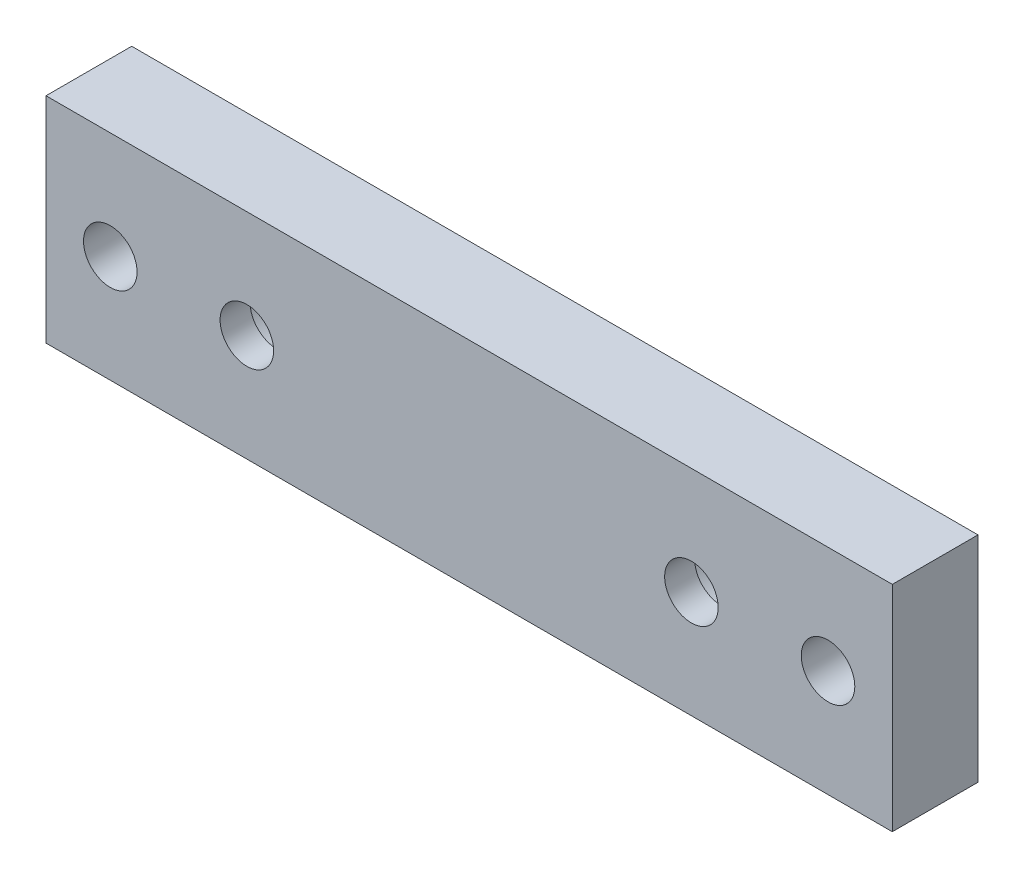
ISO-10303-21;
HEADER;
FILE_DESCRIPTION(('STEP AP214'),'2;1');
FILE_NAME('part.step','',(''),(''),'','','');
FILE_SCHEMA(('AUTOMOTIVE_DESIGN { 1 0 10303 214 1 1 1 1 }'));
ENDSEC;
DATA;
#1=APPLICATION_CONTEXT('core data for automotive mechanical design processes');
#2=APPLICATION_PROTOCOL_DEFINITION('international standard','automotive_design',2000,#1);
#3=PRODUCT_CONTEXT('',#1,'mechanical');
#4=PRODUCT('Part','Part','',(#3));
#5=PRODUCT_RELATED_PRODUCT_CATEGORY('part','',(#4));
#6=PRODUCT_DEFINITION_FORMATION('','',#4);
#7=PRODUCT_DEFINITION_CONTEXT('part definition',#1,'design');
#8=PRODUCT_DEFINITION('design','',#6,#7);
#9=PRODUCT_DEFINITION_SHAPE('','',#8);
#10=(LENGTH_UNIT() NAMED_UNIT(*) SI_UNIT(.MILLI.,.METRE.));
#11=(NAMED_UNIT(*) PLANE_ANGLE_UNIT() SI_UNIT($,.RADIAN.));
#12=(NAMED_UNIT(*) SI_UNIT($,.STERADIAN.) SOLID_ANGLE_UNIT());
#13=UNCERTAINTY_MEASURE_WITH_UNIT(LENGTH_MEASURE(1.E-05),#10,'distance_accuracy_value','');
#14=(GEOMETRIC_REPRESENTATION_CONTEXT(3) GLOBAL_UNCERTAINTY_ASSIGNED_CONTEXT((#13)) GLOBAL_UNIT_ASSIGNED_CONTEXT((#10,
#11,#12)) REPRESENTATION_CONTEXT('',''));
#15=CARTESIAN_POINT('',(0.,0.,0.));
#16=DIRECTION('',(0.,0.,1.));
#17=DIRECTION('',(1.,0.,0.));
#18=AXIS2_PLACEMENT_3D('',#15,#16,#17);
#19=CARTESIAN_POINT('',(19.5122728736646,0.,8.));
#20=DIRECTION('',(1.,0.,0.));
#21=DIRECTION('',(0.,1.,0.));
#22=AXIS2_PLACEMENT_3D('',#19,#20,#21);
#23=PLANE('',#22);
#24=DIRECTION('',(0.,-1.,0.));
#25=VECTOR('',#24,1.);
#26=CARTESIAN_POINT('',(19.5122728736646,0.,0.));
#27=LINE('',#26,#25);
#28=CARTESIAN_POINT('',(19.5122728736646,46.5405148843649,0.));
#29=VERTEX_POINT('',#28);
#30=CARTESIAN_POINT('',(19.5122728736646,26.5405148843649,0.));
#31=VERTEX_POINT('',#30);
#32=EDGE_CURVE('E120',#29,#31,#27,.T.);
#33=ORIENTED_EDGE('',*,*,#32,.F.);
#34=DIRECTION('',(0.,0.,-1.));
#35=VECTOR('',#34,1.);
#36=CARTESIAN_POINT('',(19.5122728736646,46.5405148843649,8.));
#37=LINE('',#36,#35);
#38=CARTESIAN_POINT('',(19.5122728736646,46.5405148843649,8.));
#39=VERTEX_POINT('',#38);
#40=EDGE_CURVE('E11',#39,#29,#37,.T.);
#41=ORIENTED_EDGE('',*,*,#40,.F.);
#42=DIRECTION('',(0.,-1.,0.));
#43=VECTOR('',#42,1.);
#44=CARTESIAN_POINT('',(19.5122728736646,0.,8.));
#45=LINE('',#44,#43);
#46=CARTESIAN_POINT('',(19.5122728736646,26.5405148843649,8.));
#47=VERTEX_POINT('',#46);
#48=EDGE_CURVE('E100',#39,#47,#45,.T.);
#49=ORIENTED_EDGE('',*,*,#48,.T.);
#50=DIRECTION('',(0.,0.,-1.));
#51=VECTOR('',#50,1.);
#52=CARTESIAN_POINT('',(19.5122728736646,26.5405148843649,8.));
#53=LINE('',#52,#51);
#54=EDGE_CURVE('E77',#47,#31,#53,.T.);
#55=ORIENTED_EDGE('',*,*,#54,.T.);
#56=EDGE_LOOP('',(#33,#41,#49,#55));
#57=FACE_BOUND('',#56,.T.);
#58=ADVANCED_FACE('F35',(#57),#23,.T.);
#59=CARTESIAN_POINT('',(0.,46.5405148843649,8.));
#60=DIRECTION('',(0.,1.,0.));
#61=DIRECTION('',(0.,0.,1.));
#62=AXIS2_PLACEMENT_3D('',#59,#60,#61);
#63=PLANE('',#62);
#64=DIRECTION('',(1.,0.,0.));
#65=VECTOR('',#64,1.);
#66=CARTESIAN_POINT('',(0.,46.5405148843649,0.));
#67=LINE('',#66,#65);
#68=CARTESIAN_POINT('',(-59.4877271263354,46.5405148843649,0.));
#69=VERTEX_POINT('',#68);
#70=EDGE_CURVE('E89',#69,#29,#67,.T.);
#71=ORIENTED_EDGE('',*,*,#70,.F.);
#72=DIRECTION('',(0.,0.,-1.));
#73=VECTOR('',#72,1.);
#74=CARTESIAN_POINT('',(-59.4877271263354,46.5405148843649,8.));
#75=LINE('',#74,#73);
#76=CARTESIAN_POINT('',(-59.4877271263354,46.5405148843649,8.));
#77=VERTEX_POINT('',#76);
#78=EDGE_CURVE('E45',#77,#69,#75,.T.);
#79=ORIENTED_EDGE('',*,*,#78,.F.);
#80=DIRECTION('',(1.,0.,0.));
#81=VECTOR('',#80,1.);
#82=CARTESIAN_POINT('',(0.,46.5405148843649,8.));
#83=LINE('',#82,#81);
#84=EDGE_CURVE('E87',#77,#39,#83,.T.);
#85=ORIENTED_EDGE('',*,*,#84,.T.);
#86=ORIENTED_EDGE('',*,*,#40,.T.);
#87=EDGE_LOOP('',(#71,#79,#85,#86));
#88=FACE_BOUND('',#87,.T.);
#89=ADVANCED_FACE('F85',(#88),#63,.T.);
#90=CARTESIAN_POINT('',(-59.4877271263354,0.,8.));
#91=DIRECTION('',(1.,0.,0.));
#92=DIRECTION('',(0.,0.,-1.));
#93=AXIS2_PLACEMENT_3D('',#90,#91,#92);
#94=PLANE('',#93);
#95=DIRECTION('',(0.,-1.,0.));
#96=VECTOR('',#95,1.);
#97=CARTESIAN_POINT('',(-59.4877271263354,0.,0.));
#98=LINE('',#97,#96);
#99=CARTESIAN_POINT('',(-59.4877271263354,26.5405148843649,0.));
#100=VERTEX_POINT('',#99);
#101=EDGE_CURVE('E123',#69,#100,#98,.T.);
#102=ORIENTED_EDGE('',*,*,#101,.T.);
#103=DIRECTION('',(0.,0.,-1.));
#104=VECTOR('',#103,1.);
#105=CARTESIAN_POINT('',(-59.4877271263354,26.5405148843649,8.));
#106=LINE('',#105,#104);
#107=CARTESIAN_POINT('',(-59.4877271263354,26.5405148843649,8.));
#108=VERTEX_POINT('',#107);
#109=EDGE_CURVE('E92',#108,#100,#106,.T.);
#110=ORIENTED_EDGE('',*,*,#109,.F.);
#111=DIRECTION('',(0.,-1.,0.));
#112=VECTOR('',#111,1.);
#113=CARTESIAN_POINT('',(-59.4877271263354,0.,8.));
#114=LINE('',#113,#112);
#115=EDGE_CURVE('E95',#77,#108,#114,.T.);
#116=ORIENTED_EDGE('',*,*,#115,.F.);
#117=ORIENTED_EDGE('',*,*,#78,.T.);
#118=EDGE_LOOP('',(#102,#110,#116,#117));
#119=FACE_BOUND('',#118,.T.);
#120=ADVANCED_FACE('F96',(#119),#94,.F.);
#121=CARTESIAN_POINT('',(-40.7377271263354,36.5405148843649,8.));
#122=DIRECTION('',(0.,0.,-1.));
#123=DIRECTION('',(-1.,0.,0.));
#124=AXIS2_PLACEMENT_3D('',#121,#122,#123);
#125=CYLINDRICAL_SURFACE('',#124,2.5);
#126=CARTESIAN_POINT('',(-40.7377271263354,36.5405148843649,5.2));
#127=DIRECTION('',(0.,0.,1.));
#128=DIRECTION('',(1.,0.,0.));
#129=AXIS2_PLACEMENT_3D('',#126,#127,#128);
#130=CIRCLE('',#129,2.5);
#131=CARTESIAN_POINT('',(-38.2377271263354,36.5405148843649,5.2));
#132=VERTEX_POINT('',#131);
#133=EDGE_CURVE('E39',#132,#132,#130,.T.);
#134=ORIENTED_EDGE('',*,*,#133,.F.);
#135=EDGE_LOOP('',(#134));
#136=FACE_BOUND('',#135,.T.);
#137=CARTESIAN_POINT('',(-40.7377271263354,36.5405148843649,8.));
#138=DIRECTION('',(0.,0.,1.));
#139=DIRECTION('',(1.,0.,0.));
#140=AXIS2_PLACEMENT_3D('',#137,#138,#139);
#141=CIRCLE('',#140,2.5);
#142=CARTESIAN_POINT('',(-38.2377271263354,36.5405148843649,8.));
#143=VERTEX_POINT('',#142);
#144=EDGE_CURVE('E107',#143,#143,#141,.T.);
#145=ORIENTED_EDGE('',*,*,#144,.T.);
#146=EDGE_LOOP('',(#145));
#147=FACE_BOUND('',#146,.T.);
#148=ADVANCED_FACE('F180',(#136,#147),#125,.F.);
#149=CARTESIAN_POINT('',(0.,26.5405148843649,8.));
#150=DIRECTION('',(0.,1.,0.));
#151=DIRECTION('',(0.,0.,1.));
#152=AXIS2_PLACEMENT_3D('',#149,#150,#151);
#153=PLANE('',#152);
#154=DIRECTION('',(1.,0.,0.));
#155=VECTOR('',#154,1.);
#156=CARTESIAN_POINT('',(0.,26.5405148843649,0.));
#157=LINE('',#156,#155);
#158=EDGE_CURVE('E70',#100,#31,#157,.T.);
#159=ORIENTED_EDGE('',*,*,#158,.T.);
#160=ORIENTED_EDGE('',*,*,#54,.F.);
#161=DIRECTION('',(1.,0.,0.));
#162=VECTOR('',#161,1.);
#163=CARTESIAN_POINT('',(0.,26.5405148843649,8.));
#164=LINE('',#163,#162);
#165=EDGE_CURVE('E54',#108,#47,#164,.T.);
#166=ORIENTED_EDGE('',*,*,#165,.F.);
#167=ORIENTED_EDGE('',*,*,#109,.T.);
#168=EDGE_LOOP('',(#159,#160,#166,#167));
#169=FACE_BOUND('',#168,.T.);
#170=ADVANCED_FACE('F174',(#169),#153,.F.);
#171=CARTESIAN_POINT('',(-53.4877271263354,36.5405148843649,8.));
#172=DIRECTION('',(0.,0.,-1.));
#173=DIRECTION('',(-1.,0.,0.));
#174=AXIS2_PLACEMENT_3D('',#171,#172,#173);
#175=CYLINDRICAL_SURFACE('',#174,2.5);
#176=CARTESIAN_POINT('',(-53.4877271263354,36.5405148843649,8.));
#177=DIRECTION('',(0.,0.,1.));
#178=DIRECTION('',(1.,0.,0.));
#179=AXIS2_PLACEMENT_3D('',#176,#177,#178);
#180=CIRCLE('',#179,2.5);
#181=CARTESIAN_POINT('',(-50.9877271263354,36.5405148843649,8.));
#182=VERTEX_POINT('',#181);
#183=EDGE_CURVE('E102',#182,#182,#180,.T.);
#184=ORIENTED_EDGE('',*,*,#183,.T.);
#185=EDGE_LOOP('',(#184));
#186=FACE_BOUND('',#185,.T.);
#187=CARTESIAN_POINT('',(-53.4877271263354,36.5405148843649,0.));
#188=DIRECTION('',(0.,0.,1.));
#189=DIRECTION('',(1.,0.,0.));
#190=AXIS2_PLACEMENT_3D('',#187,#188,#189);
#191=CIRCLE('',#190,2.5);
#192=CARTESIAN_POINT('',(-50.9877271263354,36.5405148843649,0.));
#193=VERTEX_POINT('',#192);
#194=EDGE_CURVE('E116',#193,#193,#191,.T.);
#195=ORIENTED_EDGE('',*,*,#194,.F.);
#196=EDGE_LOOP('',(#195));
#197=FACE_BOUND('',#196,.T.);
#198=ADVANCED_FACE('F147',(#186,#197),#175,.F.);
#199=CARTESIAN_POINT('',(13.5122728736646,36.5405148843649,8.));
#200=DIRECTION('',(0.,0.,-1.));
#201=DIRECTION('',(-1.,0.,0.));
#202=AXIS2_PLACEMENT_3D('',#199,#200,#201);
#203=CYLINDRICAL_SURFACE('',#202,2.5);
#204=CARTESIAN_POINT('',(13.5122728736646,36.5405148843649,8.));
#205=DIRECTION('',(0.,0.,1.));
#206=DIRECTION('',(1.,0.,0.));
#207=AXIS2_PLACEMENT_3D('',#204,#205,#206);
#208=CIRCLE('',#207,2.5);
#209=CARTESIAN_POINT('',(16.0122728736646,36.5405148843649,8.));
#210=VERTEX_POINT('',#209);
#211=EDGE_CURVE('E126',#210,#210,#208,.T.);
#212=ORIENTED_EDGE('',*,*,#211,.T.);
#213=EDGE_LOOP('',(#212));
#214=FACE_BOUND('',#213,.T.);
#215=CARTESIAN_POINT('',(13.5122728736646,36.5405148843649,0.));
#216=DIRECTION('',(0.,0.,1.));
#217=DIRECTION('',(1.,0.,0.));
#218=AXIS2_PLACEMENT_3D('',#215,#216,#217);
#219=CIRCLE('',#218,2.5);
#220=CARTESIAN_POINT('',(16.0122728736646,36.5405148843649,0.));
#221=VERTEX_POINT('',#220);
#222=EDGE_CURVE('E113',#221,#221,#219,.T.);
#223=ORIENTED_EDGE('',*,*,#222,.F.);
#224=EDGE_LOOP('',(#223));
#225=FACE_BOUND('',#224,.T.);
#226=ADVANCED_FACE('F37',(#214,#225),#203,.F.);
#227=CARTESIAN_POINT('',(0.762272873664621,36.5405148843649,8.));
#228=DIRECTION('',(0.,0.,-1.));
#229=DIRECTION('',(-1.,0.,0.));
#230=AXIS2_PLACEMENT_3D('',#227,#228,#229);
#231=CYLINDRICAL_SURFACE('',#230,2.5);
#232=CARTESIAN_POINT('',(0.762272873664621,36.5405148843649,5.2));
#233=DIRECTION('',(0.,0.,1.));
#234=DIRECTION('',(1.,0.,0.));
#235=AXIS2_PLACEMENT_3D('',#232,#233,#234);
#236=CIRCLE('',#235,2.5);
#237=CARTESIAN_POINT('',(3.26227287366462,36.5405148843649,5.2));
#238=VERTEX_POINT('',#237);
#239=EDGE_CURVE('E117',#238,#238,#236,.T.);
#240=ORIENTED_EDGE('',*,*,#239,.F.);
#241=EDGE_LOOP('',(#240));
#242=FACE_BOUND('',#241,.T.);
#243=CARTESIAN_POINT('',(0.762272873664621,36.5405148843649,8.));
#244=DIRECTION('',(0.,0.,1.));
#245=DIRECTION('',(1.,0.,0.));
#246=AXIS2_PLACEMENT_3D('',#243,#244,#245);
#247=CIRCLE('',#246,2.5);
#248=CARTESIAN_POINT('',(3.26227287366462,36.5405148843649,8.));
#249=VERTEX_POINT('',#248);
#250=EDGE_CURVE('E110',#249,#249,#247,.T.);
#251=ORIENTED_EDGE('',*,*,#250,.T.);
#252=EDGE_LOOP('',(#251));
#253=FACE_BOUND('',#252,.T.);
#254=ADVANCED_FACE('F152',(#242,#253),#231,.F.);
#255=CARTESIAN_POINT('',(0.,0.,8.));
#256=DIRECTION('',(0.,0.,1.));
#257=DIRECTION('',(1.,0.,0.));
#258=AXIS2_PLACEMENT_3D('',#255,#256,#257);
#259=PLANE('',#258);
#260=ORIENTED_EDGE('',*,*,#211,.F.);
#261=EDGE_LOOP('',(#260));
#262=FACE_BOUND('',#261,.T.);
#263=ORIENTED_EDGE('',*,*,#183,.F.);
#264=EDGE_LOOP('',(#263));
#265=FACE_BOUND('',#264,.T.);
#266=ORIENTED_EDGE('',*,*,#48,.F.);
#267=ORIENTED_EDGE('',*,*,#84,.F.);
#268=ORIENTED_EDGE('',*,*,#115,.T.);
#269=ORIENTED_EDGE('',*,*,#165,.T.);
#270=EDGE_LOOP('',(#266,#267,#268,#269));
#271=FACE_BOUND('',#270,.T.);
#272=ORIENTED_EDGE('',*,*,#144,.F.);
#273=EDGE_LOOP('',(#272));
#274=FACE_BOUND('',#273,.T.);
#275=ORIENTED_EDGE('',*,*,#250,.F.);
#276=EDGE_LOOP('',(#275));
#277=FACE_BOUND('',#276,.T.);
#278=ADVANCED_FACE('F98',(#262,#265,#271,#274,#277),#259,.T.);
#279=CARTESIAN_POINT('',(0.,0.,0.));
#280=DIRECTION('',(0.,0.,1.));
#281=DIRECTION('',(1.,0.,0.));
#282=AXIS2_PLACEMENT_3D('',#279,#280,#281);
#283=PLANE('',#282);
#284=CARTESIAN_POINT('',(-40.7377271263354,36.5405148843649,0.));
#285=DIRECTION('',(0.,0.,1.));
#286=DIRECTION('',(1.,0.,0.));
#287=AXIS2_PLACEMENT_3D('',#284,#285,#286);
#288=CIRCLE('',#287,4.5);
#289=CARTESIAN_POINT('',(-36.2377271263354,36.5405148843649,0.));
#290=VERTEX_POINT('',#289);
#291=EDGE_CURVE('E140',#290,#290,#288,.T.);
#292=ORIENTED_EDGE('',*,*,#291,.T.);
#293=EDGE_LOOP('',(#292));
#294=FACE_BOUND('',#293,.T.);
#295=CARTESIAN_POINT('',(0.762272873664621,36.5405148843649,0.));
#296=DIRECTION('',(0.,0.,1.));
#297=DIRECTION('',(1.,0.,0.));
#298=AXIS2_PLACEMENT_3D('',#295,#296,#297);
#299=CIRCLE('',#298,4.5);
#300=CARTESIAN_POINT('',(5.26227287366463,36.5405148843649,0.));
#301=VERTEX_POINT('',#300);
#302=EDGE_CURVE('E133',#301,#301,#299,.T.);
#303=ORIENTED_EDGE('',*,*,#302,.T.);
#304=EDGE_LOOP('',(#303));
#305=FACE_BOUND('',#304,.T.);
#306=ORIENTED_EDGE('',*,*,#222,.T.);
#307=EDGE_LOOP('',(#306));
#308=FACE_BOUND('',#307,.T.);
#309=ORIENTED_EDGE('',*,*,#194,.T.);
#310=EDGE_LOOP('',(#309));
#311=FACE_BOUND('',#310,.T.);
#312=ORIENTED_EDGE('',*,*,#32,.T.);
#313=ORIENTED_EDGE('',*,*,#158,.F.);
#314=ORIENTED_EDGE('',*,*,#101,.F.);
#315=ORIENTED_EDGE('',*,*,#70,.T.);
#316=EDGE_LOOP('',(#312,#313,#314,#315));
#317=FACE_BOUND('',#316,.T.);
#318=ADVANCED_FACE('F151',(#294,#305,#308,#311,#317),#283,.F.);
#319=CARTESIAN_POINT('',(0.762272873664621,36.5405148843649,5.2));
#320=DIRECTION('',(0.,0.,-1.));
#321=DIRECTION('',(-1.,0.,0.));
#322=AXIS2_PLACEMENT_3D('',#319,#320,#321);
#323=CYLINDRICAL_SURFACE('',#322,4.5);
#324=CARTESIAN_POINT('',(0.762272873664621,36.5405148843649,5.2));
#325=DIRECTION('',(0.,0.,1.));
#326=DIRECTION('',(1.,0.,0.));
#327=AXIS2_PLACEMENT_3D('',#324,#325,#326);
#328=CIRCLE('',#327,4.5);
#329=CARTESIAN_POINT('',(5.26227287366463,36.5405148843649,5.2));
#330=VERTEX_POINT('',#329);
#331=EDGE_CURVE('E129',#330,#330,#328,.T.);
#332=ORIENTED_EDGE('',*,*,#331,.T.);
#333=EDGE_LOOP('',(#332));
#334=FACE_BOUND('',#333,.T.);
#335=ORIENTED_EDGE('',*,*,#302,.F.);
#336=EDGE_LOOP('',(#335));
#337=FACE_BOUND('',#336,.T.);
#338=ADVANCED_FACE('F159',(#334,#337),#323,.F.);
#339=CARTESIAN_POINT('',(0.762272873664621,36.5405148843649,5.2));
#340=DIRECTION('',(0.,0.,1.));
#341=DIRECTION('',(1.,0.,0.));
#342=AXIS2_PLACEMENT_3D('',#339,#340,#341);
#343=PLANE('',#342);
#344=ORIENTED_EDGE('',*,*,#239,.T.);
#345=EDGE_LOOP('',(#344));
#346=FACE_BOUND('',#345,.T.);
#347=ORIENTED_EDGE('',*,*,#331,.F.);
#348=EDGE_LOOP('',(#347));
#349=FACE_BOUND('',#348,.T.);
#350=ADVANCED_FACE('F204',(#346,#349),#343,.F.);
#351=CARTESIAN_POINT('',(-40.7377271263354,36.5405148843649,5.2));
#352=DIRECTION('',(0.,0.,-1.));
#353=DIRECTION('',(-1.,0.,0.));
#354=AXIS2_PLACEMENT_3D('',#351,#352,#353);
#355=CYLINDRICAL_SURFACE('',#354,4.5);
#356=CARTESIAN_POINT('',(-40.7377271263354,36.5405148843649,5.2));
#357=DIRECTION('',(0.,0.,1.));
#358=DIRECTION('',(1.,0.,0.));
#359=AXIS2_PLACEMENT_3D('',#356,#357,#358);
#360=CIRCLE('',#359,4.5);
#361=CARTESIAN_POINT('',(-36.2377271263354,36.5405148843649,5.2));
#362=VERTEX_POINT('',#361);
#363=EDGE_CURVE('E293',#362,#362,#360,.T.);
#364=ORIENTED_EDGE('',*,*,#363,.T.);
#365=EDGE_LOOP('',(#364));
#366=FACE_BOUND('',#365,.T.);
#367=ORIENTED_EDGE('',*,*,#291,.F.);
#368=EDGE_LOOP('',(#367));
#369=FACE_BOUND('',#368,.T.);
#370=ADVANCED_FACE('F218',(#366,#369),#355,.F.);
#371=CARTESIAN_POINT('',(-40.7377271263354,36.5405148843649,5.2));
#372=DIRECTION('',(0.,0.,1.));
#373=DIRECTION('',(1.,0.,0.));
#374=AXIS2_PLACEMENT_3D('',#371,#372,#373);
#375=PLANE('',#374);
#376=ORIENTED_EDGE('',*,*,#133,.T.);
#377=EDGE_LOOP('',(#376));
#378=FACE_BOUND('',#377,.T.);
#379=ORIENTED_EDGE('',*,*,#363,.F.);
#380=EDGE_LOOP('',(#379));
#381=FACE_BOUND('',#380,.T.);
#382=ADVANCED_FACE('F223',(#378,#381),#375,.F.);
#383=CLOSED_SHELL('',(#58,#89,#120,#148,#170,#198,#226,#254,#278,#318,#338,#350,#370,#382));
#384=MANIFOLD_SOLID_BREP('B2',#383);
#385=ADVANCED_BREP_SHAPE_REPRESENTATION('',(#18,#384),#14);
#386=SHAPE_DEFINITION_REPRESENTATION(#9,#385);
ENDSEC;
END-ISO-10303-21;
